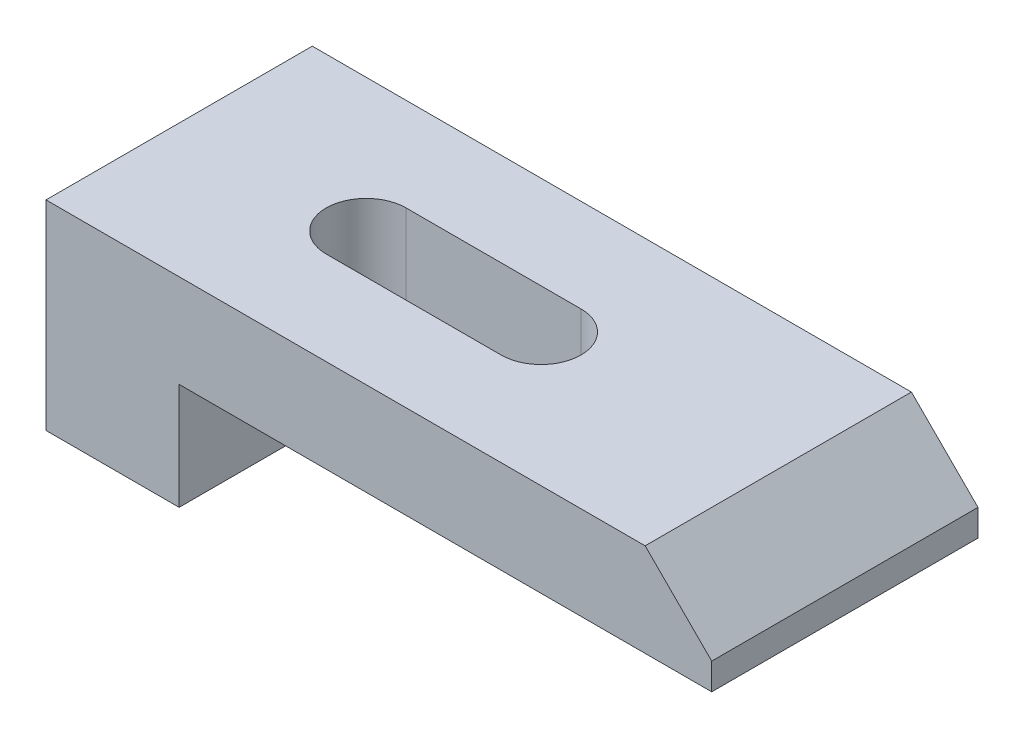
ISO-10303-21;
HEADER;
FILE_DESCRIPTION(('STEP AP214'),'2;1');
FILE_NAME('part.step','',(''),(''),'','','');
FILE_SCHEMA(('AUTOMOTIVE_DESIGN { 1 0 10303 214 1 1 1 1 }'));
ENDSEC;
DATA;
#1=APPLICATION_CONTEXT('core data for automotive mechanical design processes');
#2=APPLICATION_PROTOCOL_DEFINITION('international standard','automotive_design',2000,#1);
#3=PRODUCT_CONTEXT('',#1,'mechanical');
#4=PRODUCT('Part','Part','',(#3));
#5=PRODUCT_RELATED_PRODUCT_CATEGORY('part','',(#4));
#6=PRODUCT_DEFINITION_FORMATION('','',#4);
#7=PRODUCT_DEFINITION_CONTEXT('part definition',#1,'design');
#8=PRODUCT_DEFINITION('design','',#6,#7);
#9=PRODUCT_DEFINITION_SHAPE('','',#8);
#10=(LENGTH_UNIT() NAMED_UNIT(*) SI_UNIT(.MILLI.,.METRE.));
#11=(NAMED_UNIT(*) PLANE_ANGLE_UNIT() SI_UNIT($,.RADIAN.));
#12=(NAMED_UNIT(*) SI_UNIT($,.STERADIAN.) SOLID_ANGLE_UNIT());
#13=UNCERTAINTY_MEASURE_WITH_UNIT(LENGTH_MEASURE(1.E-05),#10,'distance_accuracy_value','');
#14=(GEOMETRIC_REPRESENTATION_CONTEXT(3) GLOBAL_UNCERTAINTY_ASSIGNED_CONTEXT((#13)) GLOBAL_UNIT_ASSIGNED_CONTEXT((#10,
#11,#12)) REPRESENTATION_CONTEXT('',''));
#15=CARTESIAN_POINT('',(0.,0.,0.));
#16=DIRECTION('',(0.,0.,1.));
#17=DIRECTION('',(1.,0.,0.));
#18=AXIS2_PLACEMENT_3D('',#15,#16,#17);
#19=CARTESIAN_POINT('',(-50.,15.,20.));
#20=DIRECTION('',(0.,-1.,0.));
#21=DIRECTION('',(0.,0.,-1.));
#22=AXIS2_PLACEMENT_3D('',#19,#20,#21);
#23=PLANE('',#22);
#24=DIRECTION('',(1.,0.,0.));
#25=VECTOR('',#24,1.);
#26=CARTESIAN_POINT('',(-35.9553228968821,15.,13.));
#27=LINE('',#26,#25);
#28=CARTESIAN_POINT('',(-35.9553228968821,15.,13.));
#29=VERTEX_POINT('',#28);
#30=CARTESIAN_POINT('',(-22.8183638873151,15.,13.));
#31=VERTEX_POINT('',#30);
#32=EDGE_CURVE('E128',#29,#31,#27,.T.);
#33=ORIENTED_EDGE('',*,*,#32,.F.);
#34=CARTESIAN_POINT('',(-35.9553228968821,15.,10.));
#35=DIRECTION('',(0.,1.,0.));
#36=DIRECTION('',(0.,0.,1.));
#37=AXIS2_PLACEMENT_3D('',#34,#35,#36);
#38=CIRCLE('',#37,3.00000000000001);
#39=CARTESIAN_POINT('',(-35.9553228968821,15.,6.99999999999999));
#40=VERTEX_POINT('',#39);
#41=EDGE_CURVE('E48',#40,#29,#38,.T.);
#42=ORIENTED_EDGE('',*,*,#41,.F.);
#43=DIRECTION('',(-1.,0.,0.));
#44=VECTOR('',#43,1.);
#45=CARTESIAN_POINT('',(-35.9553228968821,15.,6.99999999999999));
#46=LINE('',#45,#44);
#47=CARTESIAN_POINT('',(-22.8183638873151,15.,6.99999999999999));
#48=VERTEX_POINT('',#47);
#49=EDGE_CURVE('E134',#48,#40,#46,.T.);
#50=ORIENTED_EDGE('',*,*,#49,.F.);
#51=CARTESIAN_POINT('',(-22.8183638873151,15.,10.));
#52=DIRECTION('',(0.,1.,0.));
#53=DIRECTION('',(0.,0.,1.));
#54=AXIS2_PLACEMENT_3D('',#51,#52,#53);
#55=CIRCLE('',#54,3.00000000000001);
#56=EDGE_CURVE('E119',#31,#48,#55,.T.);
#57=ORIENTED_EDGE('',*,*,#56,.F.);
#58=EDGE_LOOP('',(#33,#42,#50,#57));
#59=FACE_BOUND('',#58,.T.);
#60=DIRECTION('',(-1.,0.,0.));
#61=VECTOR('',#60,1.);
#62=CARTESIAN_POINT('',(-50.,15.,20.));
#63=LINE('',#62,#61);
#64=CARTESIAN_POINT('',(-5.,15.,20.));
#65=VERTEX_POINT('',#64);
#66=CARTESIAN_POINT('',(-50.,15.,20.));
#67=VERTEX_POINT('',#66);
#68=EDGE_CURVE('E144',#65,#67,#63,.T.);
#69=ORIENTED_EDGE('',*,*,#68,.F.);
#70=DIRECTION('',(0.,0.,-1.));
#71=VECTOR('',#70,1.);
#72=CARTESIAN_POINT('',(-5.,15.,20.));
#73=LINE('',#72,#71);
#74=CARTESIAN_POINT('',(-5.,15.,0.));
#75=VERTEX_POINT('',#74);
#76=EDGE_CURVE('E184',#65,#75,#73,.T.);
#77=ORIENTED_EDGE('',*,*,#76,.T.);
#78=DIRECTION('',(-1.,0.,0.));
#79=VECTOR('',#78,1.);
#80=CARTESIAN_POINT('',(-50.,15.,0.));
#81=LINE('',#80,#79);
#82=CARTESIAN_POINT('',(-50.,15.,0.));
#83=VERTEX_POINT('',#82);
#84=EDGE_CURVE('E141',#75,#83,#81,.T.);
#85=ORIENTED_EDGE('',*,*,#84,.T.);
#86=DIRECTION('',(0.,0.,-1.));
#87=VECTOR('',#86,1.);
#88=CARTESIAN_POINT('',(-50.,15.,20.));
#89=LINE('',#88,#87);
#90=EDGE_CURVE('E181',#67,#83,#89,.T.);
#91=ORIENTED_EDGE('',*,*,#90,.F.);
#92=EDGE_LOOP('',(#69,#77,#85,#91));
#93=FACE_BOUND('',#92,.T.);
#94=ADVANCED_FACE('F33',(#59,#93),#23,.F.);
#95=CARTESIAN_POINT('',(-50.,0.,20.));
#96=DIRECTION('',(1.,0.,0.));
#97=DIRECTION('',(0.,0.,-1.));
#98=AXIS2_PLACEMENT_3D('',#95,#96,#97);
#99=PLANE('',#98);
#100=DIRECTION('',(0.,-1.,0.));
#101=VECTOR('',#100,1.);
#102=CARTESIAN_POINT('',(-50.,0.,0.));
#103=LINE('',#102,#101);
#104=CARTESIAN_POINT('',(-50.,0.,0.));
#105=VERTEX_POINT('',#104);
#106=EDGE_CURVE('E160',#83,#105,#103,.T.);
#107=ORIENTED_EDGE('',*,*,#106,.T.);
#108=DIRECTION('',(0.,0.,-1.));
#109=VECTOR('',#108,1.);
#110=CARTESIAN_POINT('',(-50.,0.,20.));
#111=LINE('',#110,#109);
#112=CARTESIAN_POINT('',(-50.,0.,20.));
#113=VERTEX_POINT('',#112);
#114=EDGE_CURVE('E178',#113,#105,#111,.T.);
#115=ORIENTED_EDGE('',*,*,#114,.F.);
#116=DIRECTION('',(0.,-1.,0.));
#117=VECTOR('',#116,1.);
#118=CARTESIAN_POINT('',(-50.,0.,20.));
#119=LINE('',#118,#117);
#120=EDGE_CURVE('E146',#67,#113,#119,.T.);
#121=ORIENTED_EDGE('',*,*,#120,.F.);
#122=ORIENTED_EDGE('',*,*,#90,.T.);
#123=EDGE_LOOP('',(#107,#115,#121,#122));
#124=FACE_BOUND('',#123,.T.);
#125=ADVANCED_FACE('F215',(#124),#99,.F.);
#126=CARTESIAN_POINT('',(-40.,0.,20.));
#127=DIRECTION('',(0.,1.,0.));
#128=DIRECTION('',(-1.,0.,0.));
#129=AXIS2_PLACEMENT_3D('',#126,#127,#128);
#130=PLANE('',#129);
#131=DIRECTION('',(1.,0.,0.));
#132=VECTOR('',#131,1.);
#133=CARTESIAN_POINT('',(-40.,0.,0.));
#134=LINE('',#133,#132);
#135=CARTESIAN_POINT('',(-40.,0.,0.));
#136=VERTEX_POINT('',#135);
#137=EDGE_CURVE('E162',#105,#136,#134,.T.);
#138=ORIENTED_EDGE('',*,*,#137,.T.);
#139=DIRECTION('',(0.,0.,-1.));
#140=VECTOR('',#139,1.);
#141=CARTESIAN_POINT('',(-40.,0.,20.));
#142=LINE('',#141,#140);
#143=CARTESIAN_POINT('',(-40.,0.,20.));
#144=VERTEX_POINT('',#143);
#145=EDGE_CURVE('E175',#144,#136,#142,.T.);
#146=ORIENTED_EDGE('',*,*,#145,.F.);
#147=DIRECTION('',(1.,0.,0.));
#148=VECTOR('',#147,1.);
#149=CARTESIAN_POINT('',(-40.,0.,20.));
#150=LINE('',#149,#148);
#151=EDGE_CURVE('E149',#113,#144,#150,.T.);
#152=ORIENTED_EDGE('',*,*,#151,.F.);
#153=ORIENTED_EDGE('',*,*,#114,.T.);
#154=EDGE_LOOP('',(#138,#146,#152,#153));
#155=FACE_BOUND('',#154,.T.);
#156=ADVANCED_FACE('F219',(#155),#130,.F.);
#157=CARTESIAN_POINT('',(-40.,7.99999999999999,20.));
#158=DIRECTION('',(-1.,0.,0.));
#159=DIRECTION('',(0.,0.,1.));
#160=AXIS2_PLACEMENT_3D('',#157,#158,#159);
#161=PLANE('',#160);
#162=DIRECTION('',(0.,1.,0.));
#163=VECTOR('',#162,1.);
#164=CARTESIAN_POINT('',(-40.,7.99999999999999,0.));
#165=LINE('',#164,#163);
#166=CARTESIAN_POINT('',(-40.,7.99999999999999,0.));
#167=VERTEX_POINT('',#166);
#168=EDGE_CURVE('E164',#136,#167,#165,.T.);
#169=ORIENTED_EDGE('',*,*,#168,.T.);
#170=DIRECTION('',(0.,0.,-1.));
#171=VECTOR('',#170,1.);
#172=CARTESIAN_POINT('',(-40.,7.99999999999999,20.));
#173=LINE('',#172,#171);
#174=CARTESIAN_POINT('',(-40.,7.99999999999999,20.));
#175=VERTEX_POINT('',#174);
#176=EDGE_CURVE('E172',#175,#167,#173,.T.);
#177=ORIENTED_EDGE('',*,*,#176,.F.);
#178=DIRECTION('',(0.,1.,0.));
#179=VECTOR('',#178,1.);
#180=CARTESIAN_POINT('',(-40.,7.99999999999999,20.));
#181=LINE('',#180,#179);
#182=EDGE_CURVE('E151',#144,#175,#181,.T.);
#183=ORIENTED_EDGE('',*,*,#182,.F.);
#184=ORIENTED_EDGE('',*,*,#145,.T.);
#185=EDGE_LOOP('',(#169,#177,#183,#184));
#186=FACE_BOUND('',#185,.T.);
#187=ADVANCED_FACE('F225',(#186),#161,.F.);
#188=CARTESIAN_POINT('',(0.,8.,20.));
#189=DIRECTION('',(0.,1.,0.));
#190=DIRECTION('',(-1.,0.,0.));
#191=AXIS2_PLACEMENT_3D('',#188,#189,#190);
#192=PLANE('',#191);
#193=DIRECTION('',(-1.,0.,0.));
#194=VECTOR('',#193,1.);
#195=CARTESIAN_POINT('',(0.,8.,6.99999999999999));
#196=LINE('',#195,#194);
#197=CARTESIAN_POINT('',(-22.8183638873151,8.,6.99999999999999));
#198=VERTEX_POINT('',#197);
#199=CARTESIAN_POINT('',(-35.9553228968821,8.,6.99999999999999));
#200=VERTEX_POINT('',#199);
#201=EDGE_CURVE('E41',#198,#200,#196,.T.);
#202=ORIENTED_EDGE('',*,*,#201,.T.);
#203=CARTESIAN_POINT('',(-35.9553228968821,7.99999999999999,10.));
#204=DIRECTION('',(0.,1.,0.));
#205=DIRECTION('',(-1.,0.,0.));
#206=AXIS2_PLACEMENT_3D('',#203,#204,#205);
#207=CIRCLE('',#206,3.00000000000001);
#208=CARTESIAN_POINT('',(-35.9553228968821,8.,13.));
#209=VERTEX_POINT('',#208);
#210=EDGE_CURVE('E11',#200,#209,#207,.T.);
#211=ORIENTED_EDGE('',*,*,#210,.T.);
#212=DIRECTION('',(1.,0.,0.));
#213=VECTOR('',#212,1.);
#214=CARTESIAN_POINT('',(0.,8.,13.));
#215=LINE('',#214,#213);
#216=CARTESIAN_POINT('',(-22.8183638873151,8.,13.));
#217=VERTEX_POINT('',#216);
#218=EDGE_CURVE('E193',#209,#217,#215,.T.);
#219=ORIENTED_EDGE('',*,*,#218,.T.);
#220=CARTESIAN_POINT('',(-22.8183638873151,8.,10.));
#221=DIRECTION('',(0.,1.,0.));
#222=DIRECTION('',(-1.,0.,0.));
#223=AXIS2_PLACEMENT_3D('',#220,#221,#222);
#224=CIRCLE('',#223,3.00000000000001);
#225=EDGE_CURVE('E122',#217,#198,#224,.T.);
#226=ORIENTED_EDGE('',*,*,#225,.T.);
#227=EDGE_LOOP('',(#202,#211,#219,#226));
#228=FACE_BOUND('',#227,.T.);
#229=DIRECTION('',(1.,0.,0.));
#230=VECTOR('',#229,1.);
#231=CARTESIAN_POINT('',(0.,8.,0.));
#232=LINE('',#231,#230);
#233=CARTESIAN_POINT('',(0.,8.,0.));
#234=VERTEX_POINT('',#233);
#235=EDGE_CURVE('E166',#167,#234,#232,.T.);
#236=ORIENTED_EDGE('',*,*,#235,.T.);
#237=DIRECTION('',(0.,0.,-1.));
#238=VECTOR('',#237,1.);
#239=CARTESIAN_POINT('',(0.,8.,20.));
#240=LINE('',#239,#238);
#241=CARTESIAN_POINT('',(0.,8.,20.));
#242=VERTEX_POINT('',#241);
#243=EDGE_CURVE('E158',#242,#234,#240,.T.);
#244=ORIENTED_EDGE('',*,*,#243,.F.);
#245=DIRECTION('',(1.,0.,0.));
#246=VECTOR('',#245,1.);
#247=CARTESIAN_POINT('',(0.,8.,20.));
#248=LINE('',#247,#246);
#249=EDGE_CURVE('E153',#175,#242,#248,.T.);
#250=ORIENTED_EDGE('',*,*,#249,.F.);
#251=ORIENTED_EDGE('',*,*,#176,.T.);
#252=EDGE_LOOP('',(#236,#244,#250,#251));
#253=FACE_BOUND('',#252,.T.);
#254=ADVANCED_FACE('F197',(#228,#253),#192,.F.);
#255=CARTESIAN_POINT('',(0.,15.,20.));
#256=DIRECTION('',(-1.,0.,0.));
#257=DIRECTION('',(0.,-1.,0.));
#258=AXIS2_PLACEMENT_3D('',#255,#256,#257);
#259=PLANE('',#258);
#260=DIRECTION('',(0.,1.,0.));
#261=VECTOR('',#260,1.);
#262=CARTESIAN_POINT('',(0.,15.,0.));
#263=LINE('',#262,#261);
#264=CARTESIAN_POINT('',(0.,9.99999999999999,0.));
#265=VERTEX_POINT('',#264);
#266=EDGE_CURVE('E147',#234,#265,#263,.T.);
#267=ORIENTED_EDGE('',*,*,#266,.T.);
#268=DIRECTION('',(0.,0.,1.));
#269=VECTOR('',#268,1.);
#270=CARTESIAN_POINT('',(0.,9.99999999999999,20.));
#271=LINE('',#270,#269);
#272=CARTESIAN_POINT('',(0.,9.99999999999999,20.));
#273=VERTEX_POINT('',#272);
#274=EDGE_CURVE('E189',#265,#273,#271,.T.);
#275=ORIENTED_EDGE('',*,*,#274,.T.);
#276=DIRECTION('',(0.,1.,0.));
#277=VECTOR('',#276,1.);
#278=CARTESIAN_POINT('',(0.,15.,20.));
#279=LINE('',#278,#277);
#280=EDGE_CURVE('E155',#242,#273,#279,.T.);
#281=ORIENTED_EDGE('',*,*,#280,.F.);
#282=ORIENTED_EDGE('',*,*,#243,.T.);
#283=EDGE_LOOP('',(#267,#275,#281,#282));
#284=FACE_BOUND('',#283,.T.);
#285=ADVANCED_FACE('F232',(#284),#259,.F.);
#286=CARTESIAN_POINT('',(0.,0.,20.));
#287=DIRECTION('',(0.,0.,-1.));
#288=DIRECTION('',(-1.,0.,0.));
#289=AXIS2_PLACEMENT_3D('',#286,#287,#288);
#290=PLANE('',#289);
#291=ORIENTED_EDGE('',*,*,#280,.T.);
#292=DIRECTION('',(0.707106781186547,-0.707106781186548,0.));
#293=VECTOR('',#292,1.);
#294=CARTESIAN_POINT('',(-5.,15.,20.));
#295=LINE('',#294,#293);
#296=EDGE_CURVE('E191',#273,#65,#295,.F.);
#297=ORIENTED_EDGE('',*,*,#296,.T.);
#298=ORIENTED_EDGE('',*,*,#68,.T.);
#299=ORIENTED_EDGE('',*,*,#120,.T.);
#300=ORIENTED_EDGE('',*,*,#151,.T.);
#301=ORIENTED_EDGE('',*,*,#182,.T.);
#302=ORIENTED_EDGE('',*,*,#249,.T.);
#303=EDGE_LOOP('',(#291,#297,#298,#299,#300,#301,#302));
#304=FACE_BOUND('',#303,.T.);
#305=ADVANCED_FACE('F235',(#304),#290,.F.);
#306=CARTESIAN_POINT('',(0.,0.,0.));
#307=DIRECTION('',(0.,0.,-1.));
#308=DIRECTION('',(-1.,0.,0.));
#309=AXIS2_PLACEMENT_3D('',#306,#307,#308);
#310=PLANE('',#309);
#311=ORIENTED_EDGE('',*,*,#84,.F.);
#312=DIRECTION('',(-0.707106781186547,0.707106781186548,0.));
#313=VECTOR('',#312,1.);
#314=CARTESIAN_POINT('',(4.99999999999999,4.99999999999998,0.));
#315=LINE('',#314,#313);
#316=EDGE_CURVE('E187',#75,#265,#315,.F.);
#317=ORIENTED_EDGE('',*,*,#316,.T.);
#318=ORIENTED_EDGE('',*,*,#266,.F.);
#319=ORIENTED_EDGE('',*,*,#235,.F.);
#320=ORIENTED_EDGE('',*,*,#168,.F.);
#321=ORIENTED_EDGE('',*,*,#137,.F.);
#322=ORIENTED_EDGE('',*,*,#106,.F.);
#323=EDGE_LOOP('',(#311,#317,#318,#319,#320,#321,#322));
#324=FACE_BOUND('',#323,.T.);
#325=ADVANCED_FACE('F210',(#324),#310,.T.);
#326=CARTESIAN_POINT('',(-5.,15.,20.));
#327=DIRECTION('',(-0.707106781186548,-0.707106781186547,0.));
#328=DIRECTION('',(0.,0.,-1.));
#329=AXIS2_PLACEMENT_3D('',#326,#327,#328);
#330=PLANE('',#329);
#331=ORIENTED_EDGE('',*,*,#296,.F.);
#332=ORIENTED_EDGE('',*,*,#274,.F.);
#333=ORIENTED_EDGE('',*,*,#316,.F.);
#334=ORIENTED_EDGE('',*,*,#76,.F.);
#335=EDGE_LOOP('',(#331,#332,#333,#334));
#336=FACE_BOUND('',#335,.T.);
#337=ADVANCED_FACE('F35',(#336),#330,.F.);
#338=CARTESIAN_POINT('',(-35.9553228968821,-5.,10.));
#339=DIRECTION('',(0.,1.,0.));
#340=DIRECTION('',(0.,0.,1.));
#341=AXIS2_PLACEMENT_3D('',#338,#339,#340);
#342=CYLINDRICAL_SURFACE('',#341,3.00000000000001);
#343=DIRECTION('',(0.,1.,0.));
#344=VECTOR('',#343,1.);
#345=CARTESIAN_POINT('',(-35.9553228968821,-5.,6.99999999999999));
#346=LINE('',#345,#344);
#347=EDGE_CURVE('E139',#200,#40,#346,.T.);
#348=ORIENTED_EDGE('',*,*,#347,.T.);
#349=ORIENTED_EDGE('',*,*,#41,.T.);
#350=DIRECTION('',(0.,1.,0.));
#351=VECTOR('',#350,1.);
#352=CARTESIAN_POINT('',(-35.9553228968821,-5.,13.));
#353=LINE('',#352,#351);
#354=EDGE_CURVE('E125',#209,#29,#353,.T.);
#355=ORIENTED_EDGE('',*,*,#354,.F.);
#356=ORIENTED_EDGE('',*,*,#210,.F.);
#357=EDGE_LOOP('',(#348,#349,#355,#356));
#358=FACE_BOUND('',#357,.T.);
#359=ADVANCED_FACE('F202',(#358),#342,.F.);
#360=CARTESIAN_POINT('',(-35.9553228968821,-5.,6.99999999999999));
#361=DIRECTION('',(0.,0.,-1.));
#362=DIRECTION('',(-1.,0.,0.));
#363=AXIS2_PLACEMENT_3D('',#360,#361,#362);
#364=PLANE('',#363);
#365=DIRECTION('',(0.,1.,0.));
#366=VECTOR('',#365,1.);
#367=CARTESIAN_POINT('',(-22.8183638873151,-5.,6.99999999999999));
#368=LINE('',#367,#366);
#369=EDGE_CURVE('E124',#198,#48,#368,.T.);
#370=ORIENTED_EDGE('',*,*,#369,.T.);
#371=ORIENTED_EDGE('',*,*,#49,.T.);
#372=ORIENTED_EDGE('',*,*,#347,.F.);
#373=ORIENTED_EDGE('',*,*,#201,.F.);
#374=EDGE_LOOP('',(#370,#371,#372,#373));
#375=FACE_BOUND('',#374,.T.);
#376=ADVANCED_FACE('F201',(#375),#364,.F.);
#377=CARTESIAN_POINT('',(-22.8183638873151,-5.,10.));
#378=DIRECTION('',(0.,1.,0.));
#379=DIRECTION('',(0.,0.,1.));
#380=AXIS2_PLACEMENT_3D('',#377,#378,#379);
#381=CYLINDRICAL_SURFACE('',#380,3.00000000000001);
#382=DIRECTION('',(0.,1.,0.));
#383=VECTOR('',#382,1.);
#384=CARTESIAN_POINT('',(-22.8183638873151,-5.,13.));
#385=LINE('',#384,#383);
#386=EDGE_CURVE('E56',#217,#31,#385,.T.);
#387=ORIENTED_EDGE('',*,*,#386,.T.);
#388=ORIENTED_EDGE('',*,*,#56,.T.);
#389=ORIENTED_EDGE('',*,*,#369,.F.);
#390=ORIENTED_EDGE('',*,*,#225,.F.);
#391=EDGE_LOOP('',(#387,#388,#389,#390));
#392=FACE_BOUND('',#391,.T.);
#393=ADVANCED_FACE('F116',(#392),#381,.F.);
#394=CARTESIAN_POINT('',(-35.9553228968821,-5.,13.));
#395=DIRECTION('',(0.,0.,1.));
#396=DIRECTION('',(1.,0.,0.));
#397=AXIS2_PLACEMENT_3D('',#394,#395,#396);
#398=PLANE('',#397);
#399=ORIENTED_EDGE('',*,*,#354,.T.);
#400=ORIENTED_EDGE('',*,*,#32,.T.);
#401=ORIENTED_EDGE('',*,*,#386,.F.);
#402=ORIENTED_EDGE('',*,*,#218,.F.);
#403=EDGE_LOOP('',(#399,#400,#401,#402));
#404=FACE_BOUND('',#403,.T.);
#405=ADVANCED_FACE('F129',(#404),#398,.F.);
#406=CLOSED_SHELL('',(#94,#125,#156,#187,#254,#285,#305,#325,#337,#359,#376,#393,#405));
#407=MANIFOLD_SOLID_BREP('B2',#406);
#408=ADVANCED_BREP_SHAPE_REPRESENTATION('',(#18,#407),#14);
#409=SHAPE_DEFINITION_REPRESENTATION(#9,#408);
ENDSEC;
END-ISO-10303-21;
